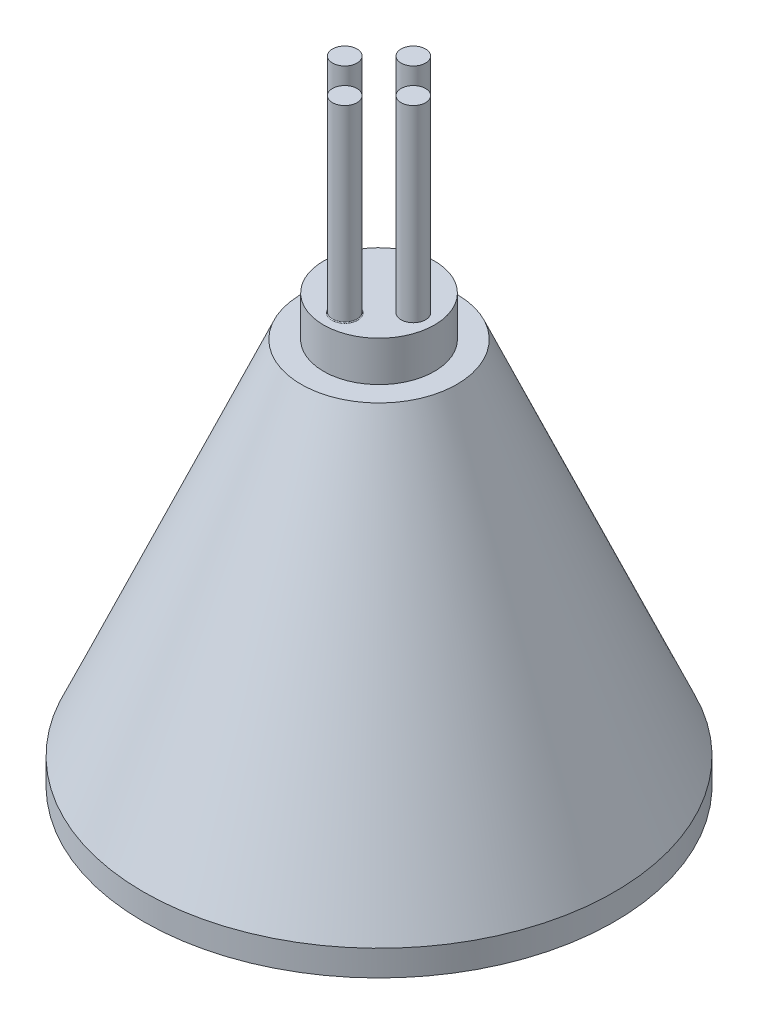
ISO-10303-21;
HEADER;
FILE_DESCRIPTION(('STEP AP214'),'2;1');
FILE_NAME('part.step','',(''),(''),'','','');
FILE_SCHEMA(('AUTOMOTIVE_DESIGN { 1 0 10303 214 1 1 1 1 }'));
ENDSEC;
DATA;
#1=APPLICATION_CONTEXT('core data for automotive mechanical design processes');
#2=APPLICATION_PROTOCOL_DEFINITION('international standard','automotive_design',2000,#1);
#3=PRODUCT_CONTEXT('',#1,'mechanical');
#4=PRODUCT('Part','Part','',(#3));
#5=PRODUCT_RELATED_PRODUCT_CATEGORY('part','',(#4));
#6=PRODUCT_DEFINITION_FORMATION('','',#4);
#7=PRODUCT_DEFINITION_CONTEXT('part definition',#1,'design');
#8=PRODUCT_DEFINITION('design','',#6,#7);
#9=PRODUCT_DEFINITION_SHAPE('','',#8);
#10=(LENGTH_UNIT() NAMED_UNIT(*) SI_UNIT(.MILLI.,.METRE.));
#11=(NAMED_UNIT(*) PLANE_ANGLE_UNIT() SI_UNIT($,.RADIAN.));
#12=(NAMED_UNIT(*) SI_UNIT($,.STERADIAN.) SOLID_ANGLE_UNIT());
#13=UNCERTAINTY_MEASURE_WITH_UNIT(LENGTH_MEASURE(1.E-05),#10,'distance_accuracy_value','');
#14=(GEOMETRIC_REPRESENTATION_CONTEXT(3) GLOBAL_UNCERTAINTY_ASSIGNED_CONTEXT((#13)) GLOBAL_UNIT_ASSIGNED_CONTEXT((#10,
#11,#12)) REPRESENTATION_CONTEXT('',''));
#15=CARTESIAN_POINT('',(0.,0.,0.));
#16=DIRECTION('',(0.,0.,1.));
#17=DIRECTION('',(1.,0.,0.));
#18=AXIS2_PLACEMENT_3D('',#15,#16,#17);
#19=CARTESIAN_POINT('',(0.,60.0527911844903,-647.128456402626));
#20=DIRECTION('',(0.,1.,0.));
#21=DIRECTION('',(0.,0.,1.));
#22=AXIS2_PLACEMENT_3D('',#19,#20,#21);
#23=CYLINDRICAL_SURFACE('',#22,6.79272966089373);
#24=CARTESIAN_POINT('',(0.,55.1305233142774,-647.128456402626));
#25=DIRECTION('',(0.,1.,0.));
#26=DIRECTION('',(0.,0.,1.));
#27=AXIS2_PLACEMENT_3D('',#24,#25,#26);
#28=CIRCLE('',#27,6.79272966089373);
#29=CARTESIAN_POINT('',(0.,55.1305233142774,-640.335726741732));
#30=VERTEX_POINT('',#29);
#31=EDGE_CURVE('E74',#30,#30,#28,.T.);
#32=ORIENTED_EDGE('',*,*,#31,.T.);
#33=EDGE_LOOP('',(#32));
#34=FACE_BOUND('',#33,.T.);
#35=CARTESIAN_POINT('',(0.,60.0527911844903,-647.128456402626));
#36=DIRECTION('',(0.,1.,0.));
#37=DIRECTION('',(0.,0.,1.));
#38=AXIS2_PLACEMENT_3D('',#35,#36,#37);
#39=CIRCLE('',#38,6.79272966089373);
#40=CARTESIAN_POINT('',(0.,60.0527911844903,-640.335726741732));
#41=VERTEX_POINT('',#40);
#42=EDGE_CURVE('E55',#41,#41,#39,.T.);
#43=ORIENTED_EDGE('',*,*,#42,.F.);
#44=EDGE_LOOP('',(#43));
#45=FACE_BOUND('',#44,.T.);
#46=ADVANCED_FACE('F42',(#34,#45),#23,.T.);
#47=CARTESIAN_POINT('',(0.,60.0527911844903,-647.128456402626));
#48=DIRECTION('',(0.,1.,0.));
#49=DIRECTION('',(0.,0.,1.));
#50=AXIS2_PLACEMENT_3D('',#47,#48,#49);
#51=PLANE('',#50);
#52=CARTESIAN_POINT('',(0.,60.0527911844903,-642.928456402626));
#53=DIRECTION('',(0.,1.,0.));
#54=DIRECTION('',(0.,0.,1.));
#55=AXIS2_PLACEMENT_3D('',#52,#53,#54);
#56=CIRCLE('',#55,1.6);
#57=CARTESIAN_POINT('',(0.,60.0527911844903,-641.328456402626));
#58=VERTEX_POINT('',#57);
#59=EDGE_CURVE('E10',#58,#58,#56,.F.);
#60=ORIENTED_EDGE('',*,*,#59,.T.);
#61=EDGE_LOOP('',(#60));
#62=FACE_BOUND('',#61,.T.);
#63=CARTESIAN_POINT('',(4.2,60.0527911844903,-647.128456402626));
#64=DIRECTION('',(0.,1.,0.));
#65=DIRECTION('',(0.,0.,1.));
#66=AXIS2_PLACEMENT_3D('',#63,#64,#65);
#67=CIRCLE('',#66,1.5);
#68=CARTESIAN_POINT('',(4.2,60.0527911844903,-648.628456402626));
#69=VERTEX_POINT('',#68);
#70=EDGE_CURVE('E98',#69,#69,#67,.T.);
#71=ORIENTED_EDGE('',*,*,#70,.F.);
#72=EDGE_LOOP('',(#71));
#73=FACE_BOUND('',#72,.T.);
#74=CARTESIAN_POINT('',(-4.2,60.0527911844903,-647.128456402626));
#75=DIRECTION('',(0.,1.,0.));
#76=DIRECTION('',(0.,0.,1.));
#77=AXIS2_PLACEMENT_3D('',#74,#75,#76);
#78=CIRCLE('',#77,1.5);
#79=CARTESIAN_POINT('',(-4.2,60.0527911844903,-648.628456402626));
#80=VERTEX_POINT('',#79);
#81=EDGE_CURVE('E83',#80,#80,#78,.T.);
#82=ORIENTED_EDGE('',*,*,#81,.F.);
#83=EDGE_LOOP('',(#82));
#84=FACE_BOUND('',#83,.T.);
#85=CARTESIAN_POINT('',(0.,60.0527911844903,-651.328456402626));
#86=DIRECTION('',(0.,1.,0.));
#87=DIRECTION('',(0.,0.,1.));
#88=AXIS2_PLACEMENT_3D('',#85,#86,#87);
#89=CIRCLE('',#88,1.5);
#90=CARTESIAN_POINT('',(0.,60.0527911844903,-652.828456402626));
#91=VERTEX_POINT('',#90);
#92=EDGE_CURVE('E79',#91,#91,#89,.T.);
#93=ORIENTED_EDGE('',*,*,#92,.F.);
#94=EDGE_LOOP('',(#93));
#95=FACE_BOUND('',#94,.T.);
#96=ORIENTED_EDGE('',*,*,#42,.T.);
#97=EDGE_LOOP('',(#96));
#98=FACE_BOUND('',#97,.T.);
#99=ADVANCED_FACE('F109',(#62,#73,#84,#95,#98),#51,.T.);
#100=CARTESIAN_POINT('',(0.,7.77830640282968,-618.283966683179));
#101=DIRECTION('',(0.,-1.,0.));
#102=DIRECTION('',(0.,0.,-1.));
#103=AXIS2_PLACEMENT_3D('',#100,#101,#102);
#104=PLANE('',#103);
#105=CARTESIAN_POINT('',(0.,7.77830640282968,-647.128456402626));
#106=DIRECTION('',(0.,1.,0.));
#107=DIRECTION('',(0.,0.,1.));
#108=AXIS2_PLACEMENT_3D('',#105,#106,#107);
#109=CIRCLE('',#108,28.8444897194473);
#110=CARTESIAN_POINT('',(0.,7.77830640282968,-618.283966683179));
#111=VERTEX_POINT('',#110);
#112=EDGE_CURVE('E60',#111,#111,#109,.T.);
#113=ORIENTED_EDGE('',*,*,#112,.F.);
#114=EDGE_LOOP('',(#113));
#115=FACE_BOUND('',#114,.T.);
#116=ADVANCED_FACE('F112',(#115),#104,.T.);
#117=CARTESIAN_POINT('',(0.,60.0527911844903,-647.128456402626));
#118=DIRECTION('',(0.,1.,0.));
#119=DIRECTION('',(0.,0.,1.));
#120=AXIS2_PLACEMENT_3D('',#117,#118,#119);
#121=CYLINDRICAL_SURFACE('',#120,28.8444897194473);
#122=ORIENTED_EDGE('',*,*,#112,.T.);
#123=EDGE_LOOP('',(#122));
#124=FACE_BOUND('',#123,.T.);
#125=CARTESIAN_POINT('',(0.,10.9285578397659,-647.128456402626));
#126=DIRECTION('',(0.,1.,0.));
#127=DIRECTION('',(0.,0.,1.));
#128=AXIS2_PLACEMENT_3D('',#125,#126,#127);
#129=CIRCLE('',#128,28.8444897194473);
#130=CARTESIAN_POINT('',(0.,10.9285578397659,-675.972946122073));
#131=VERTEX_POINT('',#130);
#132=EDGE_CURVE('E66',#131,#131,#129,.T.);
#133=ORIENTED_EDGE('',*,*,#132,.F.);
#134=EDGE_LOOP('',(#133));
#135=FACE_BOUND('',#134,.T.);
#136=ADVANCED_FACE('F127',(#124,#135),#121,.T.);
#137=CARTESIAN_POINT('',(0.,55.1305233142774,-647.128456402626));
#138=DIRECTION('',(0.,-1.,0.));
#139=DIRECTION('',(0.,0.,-1.));
#140=AXIS2_PLACEMENT_3D('',#137,#138,#139);
#141=CONICAL_SURFACE('',#140,9.54919966821288,0.41159230246249);
#142=CARTESIAN_POINT('',(0.,55.1305233142774,-647.128456402626));
#143=DIRECTION('',(0.,1.,0.));
#144=DIRECTION('',(0.,0.,1.));
#145=AXIS2_PLACEMENT_3D('',#142,#143,#144);
#146=CIRCLE('',#145,9.54919966821288);
#147=CARTESIAN_POINT('',(0.,55.1305233142774,-656.677656070839));
#148=VERTEX_POINT('',#147);
#149=EDGE_CURVE('E70',#148,#148,#146,.T.);
#150=CARTESIAN_POINT('',(0.,10.9285578397659,-675.972946122073));
#151=CARTESIAN_POINT('',(0.,11.3889949801254,-675.771953517373));
#152=CARTESIAN_POINT('',(0.,11.8494321204849,-675.570960912673));
#153=CARTESIAN_POINT('',(0.,12.7703064012039,-675.168975703272));
#154=CARTESIAN_POINT('',(0.,13.2307435415634,-674.967983098572));
#155=CARTESIAN_POINT('',(0.,14.1516178222824,-674.565997889171));
#156=CARTESIAN_POINT('',(0.,14.6120549626419,-674.365005284471));
#157=CARTESIAN_POINT('',(0.,15.5329292433609,-673.96302007507));
#158=CARTESIAN_POINT('',(0.,15.9933663837204,-673.76202747037));
#159=CARTESIAN_POINT('',(0.,16.9142406644394,-673.360042260969));
#160=CARTESIAN_POINT('',(0.,17.3746778047988,-673.159049656269));
#161=CARTESIAN_POINT('',(0.,18.2955520855178,-672.757064446868));
#162=CARTESIAN_POINT('',(0.,18.7559892258773,-672.556071842167));
#163=CARTESIAN_POINT('',(0.,19.6768635065963,-672.154086632767));
#164=CARTESIAN_POINT('',(0.,20.1373006469558,-671.953094028066));
#165=CARTESIAN_POINT('',(0.,21.0581749276748,-671.551108818666));
#166=CARTESIAN_POINT('',(0.,21.5186120680343,-671.350116213965));
#167=CARTESIAN_POINT('',(0.,22.4394863487533,-670.948131004565));
#168=CARTESIAN_POINT('',(0.,22.8999234891128,-670.747138399864));
#169=CARTESIAN_POINT('',(0.,23.8207977698318,-670.345153190463));
#170=CARTESIAN_POINT('',(0.,24.2812349101913,-670.144160585763));
#171=CARTESIAN_POINT('',(0.,25.2021091909103,-669.742175376362));
#172=CARTESIAN_POINT('',(0.,25.6625463312698,-669.541182771662));
#173=CARTESIAN_POINT('',(0.,26.5834206119887,-669.139197562261));
#174=CARTESIAN_POINT('',(0.,27.0438577523482,-668.938204957561));
#175=CARTESIAN_POINT('',(0.,27.9647320330672,-668.53621974816));
#176=CARTESIAN_POINT('',(0.,28.4251691734267,-668.33522714346));
#177=CARTESIAN_POINT('',(0.,29.3460434541457,-667.933241934059));
#178=CARTESIAN_POINT('',(0.,29.8064805945052,-667.732249329359));
#179=CARTESIAN_POINT('',(0.,30.7273548752242,-667.330264119958));
#180=CARTESIAN_POINT('',(0.,31.1877920155837,-667.129271515258));
#181=CARTESIAN_POINT('',(0.,32.1086662963027,-666.727286305857));
#182=CARTESIAN_POINT('',(0.,32.5691034366622,-666.526293701157));
#183=CARTESIAN_POINT('',(0.,33.4899777173812,-666.124308491756));
#184=CARTESIAN_POINT('',(0.,33.9504148577407,-665.923315887055));
#185=CARTESIAN_POINT('',(0.,34.8712891384596,-665.521330677655));
#186=CARTESIAN_POINT('',(0.,35.3317262788191,-665.320338072954));
#187=CARTESIAN_POINT('',(0.,36.2526005595381,-664.918352863554));
#188=CARTESIAN_POINT('',(0.,36.7130376998976,-664.717360258853));
#189=CARTESIAN_POINT('',(0.,37.6339119806166,-664.315375049453));
#190=CARTESIAN_POINT('',(0.,38.0943491209761,-664.114382444752));
#191=CARTESIAN_POINT('',(0.,39.0152234016951,-663.712397235352));
#192=CARTESIAN_POINT('',(0.,39.4756605420546,-663.511404630651));
#193=CARTESIAN_POINT('',(0.,40.3965348227736,-663.109419421251));
#194=CARTESIAN_POINT('',(0.,40.8569719631331,-662.90842681655));
#195=CARTESIAN_POINT('',(0.,41.7778462438521,-662.506441607149));
#196=CARTESIAN_POINT('',(0.,42.2382833842116,-662.305449002449));
#197=CARTESIAN_POINT('',(0.,43.1591576649306,-661.903463793048));
#198=CARTESIAN_POINT('',(0.,43.6195948052901,-661.702471188348));
#199=CARTESIAN_POINT('',(0.,44.5404690860091,-661.300485978947));
#200=CARTESIAN_POINT('',(0.,45.0009062263685,-661.099493374247));
#201=CARTESIAN_POINT('',(0.,45.9217805070875,-660.697508164846));
#202=CARTESIAN_POINT('',(0.,46.382217647447,-660.496515560146));
#203=CARTESIAN_POINT('',(0.,47.303091928166,-660.094530350745));
#204=CARTESIAN_POINT('',(0.,47.7635290685255,-659.893537746045));
#205=CARTESIAN_POINT('',(0.,48.6844033492445,-659.491552536644));
#206=CARTESIAN_POINT('',(0.,49.144840489604,-659.290559931944));
#207=CARTESIAN_POINT('',(0.,50.065714770323,-658.888574722543));
#208=CARTESIAN_POINT('',(0.,50.5261519106825,-658.687582117843));
#209=CARTESIAN_POINT('',(0.,51.4470261914015,-658.285596908442));
#210=CARTESIAN_POINT('',(0.,51.907463331761,-658.084604303742));
#211=CARTESIAN_POINT('',(0.,52.8283376124799,-657.682619094341));
#212=CARTESIAN_POINT('',(0.,53.2887747528394,-657.48162648964));
#213=CARTESIAN_POINT('',(0.,54.2096490335585,-657.07964128024));
#214=CARTESIAN_POINT('',(0.,54.670086173918,-656.878648675539));
#215=CARTESIAN_POINT('',(0.,55.1305233142774,-656.677656070839));
#216=B_SPLINE_CURVE_WITH_KNOTS('',3,(#150,#151,#152,#153,#154,#155,#156,#157,#158,#159,#160,
#161,#162,#163,#164,#165,#166,#167,#168,#169,#170,#171,#172,#173,#174,#175,#176,#177,#178,#179,
#180,#181,#182,#183,#184,#185,#186,#187,#188,#189,#190,#191,#192,#193,#194,#195,#196,#197,#198,
#199,#200,#201,#202,#203,#204,#205,#206,#207,#208,#209,#210,#211,#212,#213,#214,#215),
.UNSPECIFIED.,.F.,.F.,(4,2,2,2,2,2,2,2,2,2,2,2,2,2,2,2,2,2,2,2,2,2,2,2,2,2,2,2,2,2,2,2,4),(0.,
1.50718395901099,3.01436791802193,4.52155187703292,6.02873583604386,7.53591979505485,
9.04310375406579,10.5502877130768,12.0574716720878,13.5646556310987,15.0718395901097,
16.5790235491206,18.0862075081316,19.5933914671426,21.1005754261536,22.6077593851645,
24.1149433441755,25.6221273031865,27.1293112621974,28.6364952212084,30.1436791802194,
31.6508631392303,33.1580470982413,34.6652310572523,36.1724150162632,37.6795989752742,
39.1867829342852,40.6939668932961,42.2011508523071,43.7083348113181,45.2155187703291,
46.72270272934,48.229886688351),.UNSPECIFIED.);
#217=EDGE_CURVE('BSEAM131',#131,#148,#216,.T.);
#218=ORIENTED_EDGE('',*,*,#132,.T.);
#219=ORIENTED_EDGE('',*,*,#149,.F.);
#220=ORIENTED_EDGE('',*,*,#217,.T.);
#221=ORIENTED_EDGE('',*,*,#217,.F.);
#222=EDGE_LOOP('',(#218,#220,#219,#221));
#223=FACE_BOUND('',#222,.T.);
#224=ADVANCED_FACE('F131',(#223),#141,.T.);
#225=CARTESIAN_POINT('',(0.,55.1305233142774,-640.335726741732));
#226=DIRECTION('',(0.,1.,0.));
#227=DIRECTION('',(0.,0.,1.));
#228=AXIS2_PLACEMENT_3D('',#225,#226,#227);
#229=PLANE('',#228);
#230=ORIENTED_EDGE('',*,*,#149,.T.);
#231=EDGE_LOOP('',(#230));
#232=FACE_BOUND('',#231,.T.);
#233=ORIENTED_EDGE('',*,*,#31,.F.);
#234=EDGE_LOOP('',(#233));
#235=FACE_BOUND('',#234,.T.);
#236=ADVANCED_FACE('F135',(#232,#235),#229,.T.);
#237=CARTESIAN_POINT('',(0.,83.0927911844903,-651.328456402626));
#238=DIRECTION('',(0.,-1.,0.));
#239=DIRECTION('',(0.,0.,-1.));
#240=AXIS2_PLACEMENT_3D('',#237,#238,#239);
#241=CYLINDRICAL_SURFACE('',#240,1.5);
#242=CARTESIAN_POINT('',(0.,83.0927911844903,-651.328456402626));
#243=DIRECTION('',(0.,1.,0.));
#244=DIRECTION('',(0.,0.,1.));
#245=AXIS2_PLACEMENT_3D('',#242,#243,#244);
#246=CIRCLE('',#245,1.5);
#247=CARTESIAN_POINT('',(0.,83.0927911844903,-652.828456402626));
#248=VERTEX_POINT('',#247);
#249=EDGE_CURVE('E78',#248,#248,#246,.T.);
#250=CARTESIAN_POINT('',(0.,83.0927911844903,-652.828456402626));
#251=CARTESIAN_POINT('',(0.,82.8527911844903,-652.828456402626));
#252=CARTESIAN_POINT('',(0.,82.6127911844903,-652.828456402626));
#253=CARTESIAN_POINT('',(0.,82.1327911844903,-652.828456402626));
#254=CARTESIAN_POINT('',(0.,81.8927911844903,-652.828456402626));
#255=CARTESIAN_POINT('',(0.,81.4127911844903,-652.828456402626));
#256=CARTESIAN_POINT('',(0.,81.1727911844903,-652.828456402626));
#257=CARTESIAN_POINT('',(0.,80.6927911844903,-652.828456402626));
#258=CARTESIAN_POINT('',(0.,80.4527911844903,-652.828456402626));
#259=CARTESIAN_POINT('',(0.,79.9727911844903,-652.828456402626));
#260=CARTESIAN_POINT('',(0.,79.7327911844903,-652.828456402626));
#261=CARTESIAN_POINT('',(0.,79.2527911844903,-652.828456402626));
#262=CARTESIAN_POINT('',(0.,79.0127911844903,-652.828456402626));
#263=CARTESIAN_POINT('',(0.,78.5327911844903,-652.828456402626));
#264=CARTESIAN_POINT('',(0.,78.2927911844903,-652.828456402626));
#265=CARTESIAN_POINT('',(0.,77.8127911844903,-652.828456402626));
#266=CARTESIAN_POINT('',(0.,77.5727911844903,-652.828456402626));
#267=CARTESIAN_POINT('',(0.,77.0927911844903,-652.828456402626));
#268=CARTESIAN_POINT('',(0.,76.8527911844903,-652.828456402626));
#269=CARTESIAN_POINT('',(0.,76.3727911844903,-652.828456402626));
#270=CARTESIAN_POINT('',(0.,76.1327911844903,-652.828456402626));
#271=CARTESIAN_POINT('',(0.,75.6527911844903,-652.828456402626));
#272=CARTESIAN_POINT('',(0.,75.4127911844903,-652.828456402626));
#273=CARTESIAN_POINT('',(0.,74.9327911844903,-652.828456402626));
#274=CARTESIAN_POINT('',(0.,74.6927911844903,-652.828456402626));
#275=CARTESIAN_POINT('',(0.,74.2127911844903,-652.828456402626));
#276=CARTESIAN_POINT('',(0.,73.9727911844903,-652.828456402626));
#277=CARTESIAN_POINT('',(0.,73.4927911844903,-652.828456402626));
#278=CARTESIAN_POINT('',(0.,73.2527911844903,-652.828456402626));
#279=CARTESIAN_POINT('',(0.,72.7727911844903,-652.828456402626));
#280=CARTESIAN_POINT('',(0.,72.5327911844903,-652.828456402626));
#281=CARTESIAN_POINT('',(0.,72.0527911844903,-652.828456402626));
#282=CARTESIAN_POINT('',(0.,71.8127911844903,-652.828456402626));
#283=CARTESIAN_POINT('',(0.,71.3327911844903,-652.828456402626));
#284=CARTESIAN_POINT('',(0.,71.0927911844903,-652.828456402626));
#285=CARTESIAN_POINT('',(0.,70.6127911844903,-652.828456402626));
#286=CARTESIAN_POINT('',(0.,70.3727911844903,-652.828456402626));
#287=CARTESIAN_POINT('',(0.,69.8927911844903,-652.828456402626));
#288=CARTESIAN_POINT('',(0.,69.6527911844903,-652.828456402626));
#289=CARTESIAN_POINT('',(0.,69.1727911844903,-652.828456402626));
#290=CARTESIAN_POINT('',(0.,68.9327911844903,-652.828456402626));
#291=CARTESIAN_POINT('',(0.,68.4527911844903,-652.828456402626));
#292=CARTESIAN_POINT('',(0.,68.2127911844903,-652.828456402626));
#293=CARTESIAN_POINT('',(0.,67.7327911844903,-652.828456402626));
#294=CARTESIAN_POINT('',(0.,67.4927911844903,-652.828456402626));
#295=CARTESIAN_POINT('',(0.,67.0127911844903,-652.828456402626));
#296=CARTESIAN_POINT('',(0.,66.7727911844903,-652.828456402626));
#297=CARTESIAN_POINT('',(0.,66.2927911844903,-652.828456402626));
#298=CARTESIAN_POINT('',(0.,66.0527911844903,-652.828456402626));
#299=CARTESIAN_POINT('',(0.,65.5727911844903,-652.828456402626));
#300=CARTESIAN_POINT('',(0.,65.3327911844903,-652.828456402626));
#301=CARTESIAN_POINT('',(0.,64.8527911844903,-652.828456402626));
#302=CARTESIAN_POINT('',(0.,64.6127911844903,-652.828456402626));
#303=CARTESIAN_POINT('',(0.,64.1327911844903,-652.828456402626));
#304=CARTESIAN_POINT('',(0.,63.8927911844903,-652.828456402626));
#305=CARTESIAN_POINT('',(0.,63.4127911844903,-652.828456402626));
#306=CARTESIAN_POINT('',(0.,63.1727911844903,-652.828456402626));
#307=CARTESIAN_POINT('',(0.,62.6927911844903,-652.828456402626));
#308=CARTESIAN_POINT('',(0.,62.4527911844903,-652.828456402626));
#309=CARTESIAN_POINT('',(0.,61.9727911844903,-652.828456402626));
#310=CARTESIAN_POINT('',(0.,61.7327911844903,-652.828456402626));
#311=CARTESIAN_POINT('',(0.,61.2527911844903,-652.828456402626));
#312=CARTESIAN_POINT('',(0.,61.0127911844903,-652.828456402626));
#313=CARTESIAN_POINT('',(0.,60.5327911844903,-652.828456402626));
#314=CARTESIAN_POINT('',(0.,60.2927911844903,-652.828456402626));
#315=CARTESIAN_POINT('',(0.,60.0527911844903,-652.828456402626));
#316=B_SPLINE_CURVE_WITH_KNOTS('',3,(#250,#251,#252,#253,#254,#255,#256,#257,#258,#259,#260,
#261,#262,#263,#264,#265,#266,#267,#268,#269,#270,#271,#272,#273,#274,#275,#276,#277,#278,#279,
#280,#281,#282,#283,#284,#285,#286,#287,#288,#289,#290,#291,#292,#293,#294,#295,#296,#297,#298,
#299,#300,#301,#302,#303,#304,#305,#306,#307,#308,#309,#310,#311,#312,#313,#314,#315),
.UNSPECIFIED.,.F.,.F.,(4,2,2,2,2,2,2,2,2,2,2,2,2,2,2,2,2,2,2,2,2,2,2,2,2,2,2,2,2,2,2,2,4),(0.,
0.720000000000012,1.44000000000001,2.16000000000001,2.88000000000001,3.60000000000001,4.32,5.04,
5.76,6.48,7.20000000000001,7.92000000000001,8.64000000000001,9.36000000000001,10.08,10.8,11.52,
12.24,12.96,13.68,14.4,15.12,15.84,16.56,17.28,18.,18.72,19.44,20.16,20.88,21.6,22.32,23.04),.UNSPECIFIED.);
#317=EDGE_CURVE('BSEAM139',#248,#91,#316,.T.);
#318=ORIENTED_EDGE('',*,*,#249,.F.);
#319=ORIENTED_EDGE('',*,*,#92,.T.);
#320=ORIENTED_EDGE('',*,*,#317,.T.);
#321=ORIENTED_EDGE('',*,*,#317,.F.);
#322=EDGE_LOOP('',(#318,#320,#319,#321));
#323=FACE_BOUND('',#322,.T.);
#324=ADVANCED_FACE('F139',(#323),#241,.T.);
#325=CARTESIAN_POINT('',(0.,83.0927911844903,-651.328456402626));
#326=DIRECTION('',(0.,1.,0.));
#327=DIRECTION('',(0.,0.,1.));
#328=AXIS2_PLACEMENT_3D('',#325,#326,#327);
#329=PLANE('',#328);
#330=ORIENTED_EDGE('',*,*,#249,.T.);
#331=EDGE_LOOP('',(#330));
#332=FACE_BOUND('',#331,.T.);
#333=ADVANCED_FACE('F143',(#332),#329,.T.);
#334=CARTESIAN_POINT('',(-4.2,83.0927911844903,-647.128456402626));
#335=DIRECTION('',(0.,-1.,0.));
#336=DIRECTION('',(0.,0.,-1.));
#337=AXIS2_PLACEMENT_3D('',#334,#335,#336);
#338=CYLINDRICAL_SURFACE('',#337,1.5);
#339=CARTESIAN_POINT('',(-4.2,83.0927911844903,-647.128456402626));
#340=DIRECTION('',(0.,1.,0.));
#341=DIRECTION('',(0.,0.,1.));
#342=AXIS2_PLACEMENT_3D('',#339,#340,#341);
#343=CIRCLE('',#342,1.5);
#344=CARTESIAN_POINT('',(-4.2,83.0927911844903,-648.628456402626));
#345=VERTEX_POINT('',#344);
#346=EDGE_CURVE('E87',#345,#345,#343,.T.);
#347=CARTESIAN_POINT('',(-4.2,83.0927911844903,-648.628456402626));
#348=CARTESIAN_POINT('',(-4.2,82.8527911844903,-648.628456402626));
#349=CARTESIAN_POINT('',(-4.2,82.6127911844903,-648.628456402626));
#350=CARTESIAN_POINT('',(-4.2,82.1327911844903,-648.628456402626));
#351=CARTESIAN_POINT('',(-4.2,81.8927911844903,-648.628456402626));
#352=CARTESIAN_POINT('',(-4.2,81.4127911844903,-648.628456402626));
#353=CARTESIAN_POINT('',(-4.2,81.1727911844903,-648.628456402626));
#354=CARTESIAN_POINT('',(-4.2,80.6927911844903,-648.628456402626));
#355=CARTESIAN_POINT('',(-4.2,80.4527911844903,-648.628456402626));
#356=CARTESIAN_POINT('',(-4.2,79.9727911844903,-648.628456402626));
#357=CARTESIAN_POINT('',(-4.2,79.7327911844903,-648.628456402626));
#358=CARTESIAN_POINT('',(-4.2,79.2527911844903,-648.628456402626));
#359=CARTESIAN_POINT('',(-4.2,79.0127911844903,-648.628456402626));
#360=CARTESIAN_POINT('',(-4.2,78.5327911844903,-648.628456402626));
#361=CARTESIAN_POINT('',(-4.2,78.2927911844903,-648.628456402626));
#362=CARTESIAN_POINT('',(-4.2,77.8127911844903,-648.628456402626));
#363=CARTESIAN_POINT('',(-4.2,77.5727911844903,-648.628456402626));
#364=CARTESIAN_POINT('',(-4.2,77.0927911844903,-648.628456402626));
#365=CARTESIAN_POINT('',(-4.2,76.8527911844903,-648.628456402626));
#366=CARTESIAN_POINT('',(-4.2,76.3727911844903,-648.628456402626));
#367=CARTESIAN_POINT('',(-4.2,76.1327911844903,-648.628456402626));
#368=CARTESIAN_POINT('',(-4.2,75.6527911844903,-648.628456402626));
#369=CARTESIAN_POINT('',(-4.2,75.4127911844903,-648.628456402626));
#370=CARTESIAN_POINT('',(-4.2,74.9327911844903,-648.628456402626));
#371=CARTESIAN_POINT('',(-4.2,74.6927911844903,-648.628456402626));
#372=CARTESIAN_POINT('',(-4.2,74.2127911844903,-648.628456402626));
#373=CARTESIAN_POINT('',(-4.2,73.9727911844903,-648.628456402626));
#374=CARTESIAN_POINT('',(-4.2,73.4927911844903,-648.628456402626));
#375=CARTESIAN_POINT('',(-4.2,73.2527911844903,-648.628456402626));
#376=CARTESIAN_POINT('',(-4.2,72.7727911844903,-648.628456402626));
#377=CARTESIAN_POINT('',(-4.2,72.5327911844903,-648.628456402626));
#378=CARTESIAN_POINT('',(-4.2,72.0527911844903,-648.628456402626));
#379=CARTESIAN_POINT('',(-4.2,71.8127911844903,-648.628456402626));
#380=CARTESIAN_POINT('',(-4.2,71.3327911844903,-648.628456402626));
#381=CARTESIAN_POINT('',(-4.2,71.0927911844903,-648.628456402626));
#382=CARTESIAN_POINT('',(-4.2,70.6127911844903,-648.628456402626));
#383=CARTESIAN_POINT('',(-4.2,70.3727911844903,-648.628456402626));
#384=CARTESIAN_POINT('',(-4.2,69.8927911844903,-648.628456402626));
#385=CARTESIAN_POINT('',(-4.2,69.6527911844903,-648.628456402626));
#386=CARTESIAN_POINT('',(-4.2,69.1727911844903,-648.628456402626));
#387=CARTESIAN_POINT('',(-4.2,68.9327911844903,-648.628456402626));
#388=CARTESIAN_POINT('',(-4.2,68.4527911844903,-648.628456402626));
#389=CARTESIAN_POINT('',(-4.2,68.2127911844903,-648.628456402626));
#390=CARTESIAN_POINT('',(-4.2,67.7327911844903,-648.628456402626));
#391=CARTESIAN_POINT('',(-4.2,67.4927911844903,-648.628456402626));
#392=CARTESIAN_POINT('',(-4.2,67.0127911844903,-648.628456402626));
#393=CARTESIAN_POINT('',(-4.2,66.7727911844903,-648.628456402626));
#394=CARTESIAN_POINT('',(-4.2,66.2927911844903,-648.628456402626));
#395=CARTESIAN_POINT('',(-4.2,66.0527911844903,-648.628456402626));
#396=CARTESIAN_POINT('',(-4.2,65.5727911844903,-648.628456402626));
#397=CARTESIAN_POINT('',(-4.2,65.3327911844903,-648.628456402626));
#398=CARTESIAN_POINT('',(-4.2,64.8527911844903,-648.628456402626));
#399=CARTESIAN_POINT('',(-4.2,64.6127911844903,-648.628456402626));
#400=CARTESIAN_POINT('',(-4.2,64.1327911844903,-648.628456402626));
#401=CARTESIAN_POINT('',(-4.2,63.8927911844903,-648.628456402626));
#402=CARTESIAN_POINT('',(-4.2,63.4127911844903,-648.628456402626));
#403=CARTESIAN_POINT('',(-4.2,63.1727911844903,-648.628456402626));
#404=CARTESIAN_POINT('',(-4.2,62.6927911844903,-648.628456402626));
#405=CARTESIAN_POINT('',(-4.2,62.4527911844903,-648.628456402626));
#406=CARTESIAN_POINT('',(-4.2,61.9727911844903,-648.628456402626));
#407=CARTESIAN_POINT('',(-4.2,61.7327911844903,-648.628456402626));
#408=CARTESIAN_POINT('',(-4.2,61.2527911844903,-648.628456402626));
#409=CARTESIAN_POINT('',(-4.2,61.0127911844903,-648.628456402626));
#410=CARTESIAN_POINT('',(-4.2,60.5327911844903,-648.628456402626));
#411=CARTESIAN_POINT('',(-4.2,60.2927911844903,-648.628456402626));
#412=CARTESIAN_POINT('',(-4.2,60.0527911844903,-648.628456402626));
#413=B_SPLINE_CURVE_WITH_KNOTS('',3,(#347,#348,#349,#350,#351,#352,#353,#354,#355,#356,#357,
#358,#359,#360,#361,#362,#363,#364,#365,#366,#367,#368,#369,#370,#371,#372,#373,#374,#375,#376,
#377,#378,#379,#380,#381,#382,#383,#384,#385,#386,#387,#388,#389,#390,#391,#392,#393,#394,#395,
#396,#397,#398,#399,#400,#401,#402,#403,#404,#405,#406,#407,#408,#409,#410,#411,#412),
.UNSPECIFIED.,.F.,.F.,(4,2,2,2,2,2,2,2,2,2,2,2,2,2,2,2,2,2,2,2,2,2,2,2,2,2,2,2,2,2,2,2,4),(0.,
0.720000000000012,1.44000000000001,2.16000000000001,2.88000000000001,3.60000000000001,4.32,5.04,
5.76,6.48,7.20000000000001,7.92000000000001,8.64000000000001,9.36000000000001,10.08,10.8,11.52,
12.24,12.96,13.68,14.4,15.12,15.84,16.56,17.28,18.,18.72,19.44,20.16,20.88,21.6,22.32,23.04),.UNSPECIFIED.);
#414=EDGE_CURVE('BSEAM147',#345,#80,#413,.T.);
#415=ORIENTED_EDGE('',*,*,#346,.F.);
#416=ORIENTED_EDGE('',*,*,#81,.T.);
#417=ORIENTED_EDGE('',*,*,#414,.T.);
#418=ORIENTED_EDGE('',*,*,#414,.F.);
#419=EDGE_LOOP('',(#415,#417,#416,#418));
#420=FACE_BOUND('',#419,.T.);
#421=ADVANCED_FACE('F147',(#420),#338,.T.);
#422=CARTESIAN_POINT('',(-4.2,83.0927911844903,-647.128456402626));
#423=DIRECTION('',(0.,1.,0.));
#424=DIRECTION('',(0.,0.,1.));
#425=AXIS2_PLACEMENT_3D('',#422,#423,#424);
#426=PLANE('',#425);
#427=ORIENTED_EDGE('',*,*,#346,.T.);
#428=EDGE_LOOP('',(#427));
#429=FACE_BOUND('',#428,.T.);
#430=ADVANCED_FACE('F149',(#429),#426,.T.);
#431=CARTESIAN_POINT('',(0.,83.0927911844903,-642.928456402626));
#432=DIRECTION('',(0.,-1.,0.));
#433=DIRECTION('',(0.,0.,-1.));
#434=AXIS2_PLACEMENT_3D('',#431,#432,#433);
#435=CYLINDRICAL_SURFACE('',#434,1.5);
#436=CARTESIAN_POINT('',(0.,60.1527911844903,-642.928456402626));
#437=DIRECTION('',(0.,1.,0.));
#438=DIRECTION('',(0.,0.,1.));
#439=AXIS2_PLACEMENT_3D('',#436,#437,#438);
#440=CIRCLE('',#439,1.5);
#441=CARTESIAN_POINT('',(0.,60.1527911844903,-644.428456402626));
#442=VERTEX_POINT('',#441);
#443=EDGE_CURVE('E50',#442,#442,#440,.T.);
#444=CARTESIAN_POINT('',(0.,83.0927911844903,-642.928456402626));
#445=DIRECTION('',(0.,1.,0.));
#446=DIRECTION('',(0.,0.,1.));
#447=AXIS2_PLACEMENT_3D('',#444,#445,#446);
#448=CIRCLE('',#447,1.5);
#449=CARTESIAN_POINT('',(0.,83.0927911844903,-644.428456402626));
#450=VERTEX_POINT('',#449);
#451=EDGE_CURVE('E91',#450,#450,#448,.T.);
#452=CARTESIAN_POINT('',(0.,60.1527911844903,-644.428456402626));
#453=CARTESIAN_POINT('',(0.,60.3917495178236,-644.428456402626));
#454=CARTESIAN_POINT('',(0.,60.630707851157,-644.428456402626));
#455=CARTESIAN_POINT('',(0.,61.1086245178236,-644.428456402626));
#456=CARTESIAN_POINT('',(0.,61.347582851157,-644.428456402626));
#457=CARTESIAN_POINT('',(0.,61.8254995178236,-644.428456402626));
#458=CARTESIAN_POINT('',(0.,62.064457851157,-644.428456402626));
#459=CARTESIAN_POINT('',(0.,62.5423745178236,-644.428456402626));
#460=CARTESIAN_POINT('',(0.,62.781332851157,-644.428456402626));
#461=CARTESIAN_POINT('',(0.,63.2592495178236,-644.428456402626));
#462=CARTESIAN_POINT('',(0.,63.498207851157,-644.428456402626));
#463=CARTESIAN_POINT('',(0.,63.9761245178236,-644.428456402626));
#464=CARTESIAN_POINT('',(0.,64.215082851157,-644.428456402626));
#465=CARTESIAN_POINT('',(0.,64.6929995178236,-644.428456402626));
#466=CARTESIAN_POINT('',(0.,64.931957851157,-644.428456402626));
#467=CARTESIAN_POINT('',(0.,65.4098745178236,-644.428456402626));
#468=CARTESIAN_POINT('',(0.,65.648832851157,-644.428456402626));
#469=CARTESIAN_POINT('',(0.,66.1267495178236,-644.428456402626));
#470=CARTESIAN_POINT('',(0.,66.365707851157,-644.428456402626));
#471=CARTESIAN_POINT('',(0.,66.8436245178236,-644.428456402626));
#472=CARTESIAN_POINT('',(0.,67.082582851157,-644.428456402626));
#473=CARTESIAN_POINT('',(0.,67.5604995178236,-644.428456402626));
#474=CARTESIAN_POINT('',(0.,67.799457851157,-644.428456402626));
#475=CARTESIAN_POINT('',(0.,68.2773745178236,-644.428456402626));
#476=CARTESIAN_POINT('',(0.,68.516332851157,-644.428456402626));
#477=CARTESIAN_POINT('',(0.,68.9942495178236,-644.428456402626));
#478=CARTESIAN_POINT('',(0.,69.233207851157,-644.428456402626));
#479=CARTESIAN_POINT('',(0.,69.7111245178236,-644.428456402626));
#480=CARTESIAN_POINT('',(0.,69.950082851157,-644.428456402626));
#481=CARTESIAN_POINT('',(0.,70.4279995178236,-644.428456402626));
#482=CARTESIAN_POINT('',(0.,70.666957851157,-644.428456402626));
#483=CARTESIAN_POINT('',(0.,71.1448745178236,-644.428456402626));
#484=CARTESIAN_POINT('',(0.,71.383832851157,-644.428456402626));
#485=CARTESIAN_POINT('',(0.,71.8617495178236,-644.428456402626));
#486=CARTESIAN_POINT('',(0.,72.100707851157,-644.428456402626));
#487=CARTESIAN_POINT('',(0.,72.5786245178236,-644.428456402626));
#488=CARTESIAN_POINT('',(0.,72.817582851157,-644.428456402626));
#489=CARTESIAN_POINT('',(0.,73.2954995178236,-644.428456402626));
#490=CARTESIAN_POINT('',(0.,73.534457851157,-644.428456402626));
#491=CARTESIAN_POINT('',(0.,74.0123745178236,-644.428456402626));
#492=CARTESIAN_POINT('',(0.,74.251332851157,-644.428456402626));
#493=CARTESIAN_POINT('',(0.,74.7292495178236,-644.428456402626));
#494=CARTESIAN_POINT('',(0.,74.968207851157,-644.428456402626));
#495=CARTESIAN_POINT('',(0.,75.4461245178236,-644.428456402626));
#496=CARTESIAN_POINT('',(0.,75.685082851157,-644.428456402626));
#497=CARTESIAN_POINT('',(0.,76.1629995178236,-644.428456402626));
#498=CARTESIAN_POINT('',(0.,76.401957851157,-644.428456402626));
#499=CARTESIAN_POINT('',(0.,76.8798745178236,-644.428456402626));
#500=CARTESIAN_POINT('',(0.,77.118832851157,-644.428456402626));
#501=CARTESIAN_POINT('',(0.,77.5967495178236,-644.428456402626));
#502=CARTESIAN_POINT('',(0.,77.835707851157,-644.428456402626));
#503=CARTESIAN_POINT('',(0.,78.3136245178236,-644.428456402626));
#504=CARTESIAN_POINT('',(0.,78.552582851157,-644.428456402626));
#505=CARTESIAN_POINT('',(0.,79.0304995178236,-644.428456402626));
#506=CARTESIAN_POINT('',(0.,79.269457851157,-644.428456402626));
#507=CARTESIAN_POINT('',(0.,79.7473745178236,-644.428456402626));
#508=CARTESIAN_POINT('',(0.,79.986332851157,-644.428456402626));
#509=CARTESIAN_POINT('',(0.,80.4642495178236,-644.428456402626));
#510=CARTESIAN_POINT('',(0.,80.703207851157,-644.428456402626));
#511=CARTESIAN_POINT('',(0.,81.1811245178236,-644.428456402626));
#512=CARTESIAN_POINT('',(0.,81.4200828511569,-644.428456402626));
#513=CARTESIAN_POINT('',(0.,81.8979995178236,-644.428456402626));
#514=CARTESIAN_POINT('',(0.,82.136957851157,-644.428456402626));
#515=CARTESIAN_POINT('',(0.,82.6148745178236,-644.428456402626));
#516=CARTESIAN_POINT('',(0.,82.853832851157,-644.428456402626));
#517=CARTESIAN_POINT('',(0.,83.0927911844903,-644.428456402626));
#518=B_SPLINE_CURVE_WITH_KNOTS('',3,(#452,#453,#454,#455,#456,#457,#458,#459,#460,#461,#462,
#463,#464,#465,#466,#467,#468,#469,#470,#471,#472,#473,#474,#475,#476,#477,#478,#479,#480,#481,
#482,#483,#484,#485,#486,#487,#488,#489,#490,#491,#492,#493,#494,#495,#496,#497,#498,#499,#500,
#501,#502,#503,#504,#505,#506,#507,#508,#509,#510,#511,#512,#513,#514,#515,#516,#517),
.UNSPECIFIED.,.F.,.F.,(4,2,2,2,2,2,2,2,2,2,2,2,2,2,2,2,2,2,2,2,2,2,2,2,2,2,2,2,2,2,2,2,4),(0.,
0.716875000000006,1.43375,2.150625,2.8675,3.584375,4.30125000000001,5.018125,5.735,6.451875,
7.16875,7.88562500000001,8.6025,9.319375,10.03625,10.753125,11.47,12.186875,12.90375,13.620625,
14.3375,15.054375,15.77125,16.488125,17.205,17.921875,18.63875,19.355625,20.0725,20.789375,
21.50625,22.223125,22.94),.UNSPECIFIED.);
#519=EDGE_CURVE('BSEAM152',#442,#450,#518,.T.);
#520=ORIENTED_EDGE('',*,*,#443,.T.);
#521=ORIENTED_EDGE('',*,*,#451,.F.);
#522=ORIENTED_EDGE('',*,*,#519,.T.);
#523=ORIENTED_EDGE('',*,*,#519,.F.);
#524=EDGE_LOOP('',(#520,#522,#521,#523));
#525=FACE_BOUND('',#524,.T.);
#526=ADVANCED_FACE('F152',(#525),#435,.T.);
#527=CARTESIAN_POINT('',(0.,83.0927911844903,-642.928456402626));
#528=DIRECTION('',(0.,1.,0.));
#529=DIRECTION('',(0.,0.,1.));
#530=AXIS2_PLACEMENT_3D('',#527,#528,#529);
#531=PLANE('',#530);
#532=ORIENTED_EDGE('',*,*,#451,.T.);
#533=EDGE_LOOP('',(#532));
#534=FACE_BOUND('',#533,.T.);
#535=ADVANCED_FACE('F157',(#534),#531,.T.);
#536=CARTESIAN_POINT('',(4.2,83.0927911844903,-647.128456402626));
#537=DIRECTION('',(0.,-1.,0.));
#538=DIRECTION('',(0.,0.,-1.));
#539=AXIS2_PLACEMENT_3D('',#536,#537,#538);
#540=CYLINDRICAL_SURFACE('',#539,1.5);
#541=CARTESIAN_POINT('',(4.2,83.0927911844903,-647.128456402626));
#542=DIRECTION('',(0.,1.,0.));
#543=DIRECTION('',(0.,0.,1.));
#544=AXIS2_PLACEMENT_3D('',#541,#542,#543);
#545=CIRCLE('',#544,1.5);
#546=CARTESIAN_POINT('',(4.2,83.0927911844903,-648.628456402626));
#547=VERTEX_POINT('',#546);
#548=EDGE_CURVE('E99',#547,#547,#545,.T.);
#549=CARTESIAN_POINT('',(4.2,83.0927911844903,-648.628456402626));
#550=CARTESIAN_POINT('',(4.2,82.8527911844903,-648.628456402626));
#551=CARTESIAN_POINT('',(4.2,82.6127911844903,-648.628456402626));
#552=CARTESIAN_POINT('',(4.2,82.1327911844903,-648.628456402626));
#553=CARTESIAN_POINT('',(4.2,81.8927911844903,-648.628456402626));
#554=CARTESIAN_POINT('',(4.2,81.4127911844903,-648.628456402626));
#555=CARTESIAN_POINT('',(4.2,81.1727911844903,-648.628456402626));
#556=CARTESIAN_POINT('',(4.2,80.6927911844903,-648.628456402626));
#557=CARTESIAN_POINT('',(4.2,80.4527911844903,-648.628456402626));
#558=CARTESIAN_POINT('',(4.2,79.9727911844903,-648.628456402626));
#559=CARTESIAN_POINT('',(4.2,79.7327911844903,-648.628456402626));
#560=CARTESIAN_POINT('',(4.2,79.2527911844903,-648.628456402626));
#561=CARTESIAN_POINT('',(4.2,79.0127911844903,-648.628456402626));
#562=CARTESIAN_POINT('',(4.2,78.5327911844903,-648.628456402626));
#563=CARTESIAN_POINT('',(4.2,78.2927911844903,-648.628456402626));
#564=CARTESIAN_POINT('',(4.2,77.8127911844903,-648.628456402626));
#565=CARTESIAN_POINT('',(4.2,77.5727911844903,-648.628456402626));
#566=CARTESIAN_POINT('',(4.2,77.0927911844903,-648.628456402626));
#567=CARTESIAN_POINT('',(4.2,76.8527911844903,-648.628456402626));
#568=CARTESIAN_POINT('',(4.2,76.3727911844903,-648.628456402626));
#569=CARTESIAN_POINT('',(4.2,76.1327911844903,-648.628456402626));
#570=CARTESIAN_POINT('',(4.2,75.6527911844903,-648.628456402626));
#571=CARTESIAN_POINT('',(4.2,75.4127911844903,-648.628456402626));
#572=CARTESIAN_POINT('',(4.2,74.9327911844903,-648.628456402626));
#573=CARTESIAN_POINT('',(4.2,74.6927911844903,-648.628456402626));
#574=CARTESIAN_POINT('',(4.2,74.2127911844903,-648.628456402626));
#575=CARTESIAN_POINT('',(4.2,73.9727911844903,-648.628456402626));
#576=CARTESIAN_POINT('',(4.2,73.4927911844903,-648.628456402626));
#577=CARTESIAN_POINT('',(4.2,73.2527911844903,-648.628456402626));
#578=CARTESIAN_POINT('',(4.2,72.7727911844903,-648.628456402626));
#579=CARTESIAN_POINT('',(4.2,72.5327911844903,-648.628456402626));
#580=CARTESIAN_POINT('',(4.2,72.0527911844903,-648.628456402626));
#581=CARTESIAN_POINT('',(4.2,71.8127911844903,-648.628456402626));
#582=CARTESIAN_POINT('',(4.2,71.3327911844903,-648.628456402626));
#583=CARTESIAN_POINT('',(4.2,71.0927911844903,-648.628456402626));
#584=CARTESIAN_POINT('',(4.2,70.6127911844903,-648.628456402626));
#585=CARTESIAN_POINT('',(4.2,70.3727911844903,-648.628456402626));
#586=CARTESIAN_POINT('',(4.2,69.8927911844903,-648.628456402626));
#587=CARTESIAN_POINT('',(4.2,69.6527911844903,-648.628456402626));
#588=CARTESIAN_POINT('',(4.2,69.1727911844903,-648.628456402626));
#589=CARTESIAN_POINT('',(4.2,68.9327911844903,-648.628456402626));
#590=CARTESIAN_POINT('',(4.2,68.4527911844903,-648.628456402626));
#591=CARTESIAN_POINT('',(4.2,68.2127911844903,-648.628456402626));
#592=CARTESIAN_POINT('',(4.2,67.7327911844903,-648.628456402626));
#593=CARTESIAN_POINT('',(4.2,67.4927911844903,-648.628456402626));
#594=CARTESIAN_POINT('',(4.2,67.0127911844903,-648.628456402626));
#595=CARTESIAN_POINT('',(4.2,66.7727911844903,-648.628456402626));
#596=CARTESIAN_POINT('',(4.2,66.2927911844903,-648.628456402626));
#597=CARTESIAN_POINT('',(4.2,66.0527911844903,-648.628456402626));
#598=CARTESIAN_POINT('',(4.2,65.5727911844903,-648.628456402626));
#599=CARTESIAN_POINT('',(4.2,65.3327911844903,-648.628456402626));
#600=CARTESIAN_POINT('',(4.2,64.8527911844903,-648.628456402626));
#601=CARTESIAN_POINT('',(4.2,64.6127911844903,-648.628456402626));
#602=CARTESIAN_POINT('',(4.2,64.1327911844903,-648.628456402626));
#603=CARTESIAN_POINT('',(4.2,63.8927911844903,-648.628456402626));
#604=CARTESIAN_POINT('',(4.2,63.4127911844903,-648.628456402626));
#605=CARTESIAN_POINT('',(4.2,63.1727911844903,-648.628456402626));
#606=CARTESIAN_POINT('',(4.2,62.6927911844903,-648.628456402626));
#607=CARTESIAN_POINT('',(4.2,62.4527911844903,-648.628456402626));
#608=CARTESIAN_POINT('',(4.2,61.9727911844903,-648.628456402626));
#609=CARTESIAN_POINT('',(4.2,61.7327911844903,-648.628456402626));
#610=CARTESIAN_POINT('',(4.2,61.2527911844903,-648.628456402626));
#611=CARTESIAN_POINT('',(4.2,61.0127911844903,-648.628456402626));
#612=CARTESIAN_POINT('',(4.2,60.5327911844903,-648.628456402626));
#613=CARTESIAN_POINT('',(4.2,60.2927911844903,-648.628456402626));
#614=CARTESIAN_POINT('',(4.2,60.0527911844903,-648.628456402626));
#615=B_SPLINE_CURVE_WITH_KNOTS('',3,(#549,#550,#551,#552,#553,#554,#555,#556,#557,#558,#559,
#560,#561,#562,#563,#564,#565,#566,#567,#568,#569,#570,#571,#572,#573,#574,#575,#576,#577,#578,
#579,#580,#581,#582,#583,#584,#585,#586,#587,#588,#589,#590,#591,#592,#593,#594,#595,#596,#597,
#598,#599,#600,#601,#602,#603,#604,#605,#606,#607,#608,#609,#610,#611,#612,#613,#614),
.UNSPECIFIED.,.F.,.F.,(4,2,2,2,2,2,2,2,2,2,2,2,2,2,2,2,2,2,2,2,2,2,2,2,2,2,2,2,2,2,2,2,4),(0.,
0.720000000000012,1.44000000000001,2.16000000000001,2.88000000000001,3.60000000000001,4.32,5.04,
5.76,6.48,7.20000000000001,7.92000000000001,8.64000000000001,9.36000000000001,10.08,10.8,11.52,
12.24,12.96,13.68,14.4,15.12,15.84,16.56,17.28,18.,18.72,19.44,20.16,20.88,21.6,22.32,23.04),.UNSPECIFIED.);
#616=EDGE_CURVE('BSEAM107',#547,#69,#615,.T.);
#617=ORIENTED_EDGE('',*,*,#548,.F.);
#618=ORIENTED_EDGE('',*,*,#70,.T.);
#619=ORIENTED_EDGE('',*,*,#616,.T.);
#620=ORIENTED_EDGE('',*,*,#616,.F.);
#621=EDGE_LOOP('',(#617,#619,#618,#620));
#622=FACE_BOUND('',#621,.T.);
#623=ADVANCED_FACE('F107',(#622),#540,.T.);
#624=CARTESIAN_POINT('',(4.2,83.0927911844903,-647.128456402626));
#625=DIRECTION('',(0.,1.,0.));
#626=DIRECTION('',(0.,0.,1.));
#627=AXIS2_PLACEMENT_3D('',#624,#625,#626);
#628=PLANE('',#627);
#629=ORIENTED_EDGE('',*,*,#548,.T.);
#630=EDGE_LOOP('',(#629));
#631=FACE_BOUND('',#630,.T.);
#632=ADVANCED_FACE('F163',(#631),#628,.T.);
#633=CARTESIAN_POINT('',(0.,60.1527911844903,-642.928456402626));
#634=DIRECTION('',(0.,1.,0.));
#635=DIRECTION('',(0.,0.,1.));
#636=AXIS2_PLACEMENT_3D('',#633,#634,#635);
#637=TOROIDAL_SURFACE('',#636,1.6,0.1);
#638=ORIENTED_EDGE('',*,*,#59,.F.);
#639=EDGE_LOOP('',(#638));
#640=FACE_BOUND('',#639,.T.);
#641=ORIENTED_EDGE('',*,*,#443,.F.);
#642=EDGE_LOOP('',(#641));
#643=FACE_BOUND('',#642,.T.);
#644=ADVANCED_FACE('F44',(#640,#643),#637,.F.);
#645=CLOSED_SHELL('',(#46,#99,#116,#136,#224,#236,#324,#333,#421,#430,#526,#535,#623,#632,#644));
#646=MANIFOLD_SOLID_BREP('B2',#645);
#647=ADVANCED_BREP_SHAPE_REPRESENTATION('',(#18,#646),#14);
#648=SHAPE_DEFINITION_REPRESENTATION(#9,#647);
ENDSEC;
END-ISO-10303-21;
